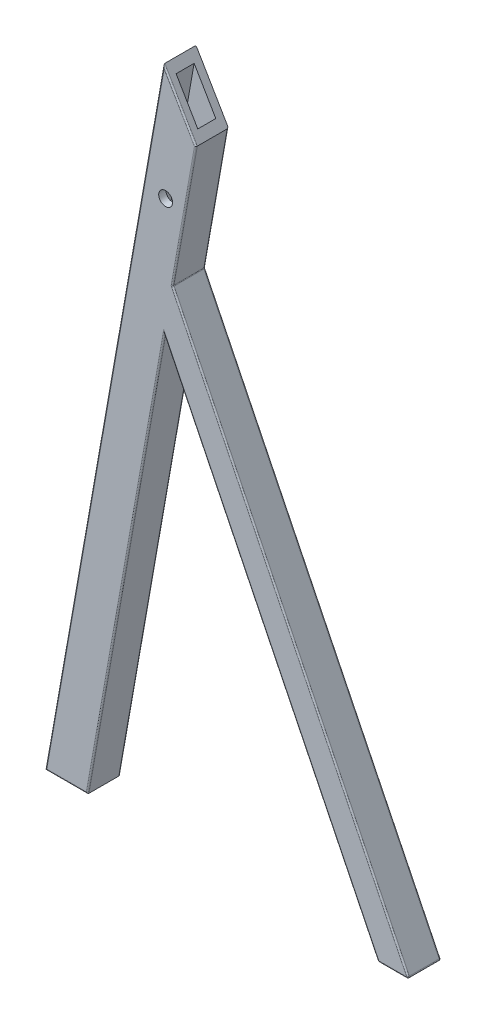
ISO-10303-21;
HEADER;
FILE_DESCRIPTION(('STEP AP214'),'2;1');
FILE_NAME('part.step','',(''),(''),'','','');
FILE_SCHEMA(('AUTOMOTIVE_DESIGN { 1 0 10303 214 1 1 1 1 }'));
ENDSEC;
DATA;
#1=APPLICATION_CONTEXT('core data for automotive mechanical design processes');
#2=APPLICATION_PROTOCOL_DEFINITION('international standard','automotive_design',2000,#1);
#3=PRODUCT_CONTEXT('',#1,'mechanical');
#4=PRODUCT('Part','Part','',(#3));
#5=PRODUCT_RELATED_PRODUCT_CATEGORY('part','',(#4));
#6=PRODUCT_DEFINITION_FORMATION('','',#4);
#7=PRODUCT_DEFINITION_CONTEXT('part definition',#1,'design');
#8=PRODUCT_DEFINITION('design','',#6,#7);
#9=PRODUCT_DEFINITION_SHAPE('','',#8);
#10=(LENGTH_UNIT() NAMED_UNIT(*) SI_UNIT(.MILLI.,.METRE.));
#11=(NAMED_UNIT(*) PLANE_ANGLE_UNIT() SI_UNIT($,.RADIAN.));
#12=(NAMED_UNIT(*) SI_UNIT($,.STERADIAN.) SOLID_ANGLE_UNIT());
#13=UNCERTAINTY_MEASURE_WITH_UNIT(LENGTH_MEASURE(1.E-05),#10,'distance_accuracy_value','');
#14=(GEOMETRIC_REPRESENTATION_CONTEXT(3) GLOBAL_UNCERTAINTY_ASSIGNED_CONTEXT((#13)) GLOBAL_UNIT_ASSIGNED_CONTEXT((#10,
#11,#12)) REPRESENTATION_CONTEXT('',''));
#15=CARTESIAN_POINT('',(0.,0.,0.));
#16=DIRECTION('',(0.,0.,1.));
#17=DIRECTION('',(1.,0.,0.));
#18=AXIS2_PLACEMENT_3D('',#15,#16,#17);
#19=CARTESIAN_POINT('',(-131.308416878332,443.163488855493,11.75));
#20=DIRECTION('',(-0.86306070064201,-0.505100214816152,0.));
#21=DIRECTION('',(0.505100214816152,-0.86306070064201,0.));
#22=AXIS2_PLACEMENT_3D('',#19,#20,#21);
#23=PLANE('',#22);
#24=DIRECTION('',(0.,0.,-1.));
#25=VECTOR('',#24,1.);
#26=CARTESIAN_POINT('',(-154.718136006566,483.163488855493,11.75));
#27=LINE('',#26,#25);
#28=CARTESIAN_POINT('',(-154.718136006566,483.163488855493,10.75));
#29=VERTEX_POINT('',#28);
#30=CARTESIAN_POINT('',(-154.718136006566,483.163488855493,-10.75));
#31=VERTEX_POINT('',#30);
#32=EDGE_CURVE('E268',#29,#31,#27,.T.);
#33=ORIENTED_EDGE('',*,*,#32,.F.);
#34=DIRECTION('',(-0.505100214816152,0.86306070064201,0.));
#35=VECTOR('',#34,1.);
#36=CARTESIAN_POINT('',(-131.308416878332,443.163488855493,10.75));
#37=LINE('',#36,#35);
#38=CARTESIAN_POINT('',(-131.308416878332,443.163488855493,10.75));
#39=VERTEX_POINT('',#38);
#40=EDGE_CURVE('E376',#29,#39,#37,.F.);
#41=ORIENTED_EDGE('',*,*,#40,.T.);
#42=DIRECTION('',(0.,0.,-1.));
#43=VECTOR('',#42,1.);
#44=CARTESIAN_POINT('',(-131.308416878332,443.163488855493,11.75));
#45=LINE('',#44,#43);
#46=CARTESIAN_POINT('',(-131.308416878332,443.163488855493,-10.75));
#47=VERTEX_POINT('',#46);
#48=EDGE_CURVE('E274',#39,#47,#45,.T.);
#49=ORIENTED_EDGE('',*,*,#48,.T.);
#50=CARTESIAN_POINT('',(-132.088740849273,444.496822188827,-10.75));
#51=DIRECTION('',(-0.86306070064201,-0.505100214816152,0.));
#52=DIRECTION('',(-0.505100214816152,0.86306070064201,0.));
#53=AXIS2_PLACEMENT_3D('',#50,#51,#52);
#54=ELLIPSE('',#53,1.54488940620456,1.);
#55=CARTESIAN_POINT('',(-132.088740849273,444.496822188827,-11.75));
#56=VERTEX_POINT('',#55);
#57=EDGE_CURVE('E372',#47,#56,#54,.F.);
#58=ORIENTED_EDGE('',*,*,#57,.T.);
#59=DIRECTION('',(-0.505100214816151,0.86306070064201,0.));
#60=VECTOR('',#59,1.);
#61=CARTESIAN_POINT('',(-131.308416878332,443.163488855493,-11.75));
#62=LINE('',#61,#60);
#63=CARTESIAN_POINT('',(-153.937812035625,481.83015552216,-11.75));
#64=VERTEX_POINT('',#63);
#65=EDGE_CURVE('E262',#56,#64,#62,.T.);
#66=ORIENTED_EDGE('',*,*,#65,.T.);
#67=CARTESIAN_POINT('',(-153.937812035625,481.83015552216,-10.75));
#68=DIRECTION('',(-0.86306070064201,-0.505100214816152,0.));
#69=DIRECTION('',(0.505100214816152,-0.86306070064201,0.));
#70=AXIS2_PLACEMENT_3D('',#67,#68,#69);
#71=ELLIPSE('',#70,1.54488940620456,1.);
#72=EDGE_CURVE('E374',#64,#31,#71,.F.);
#73=ORIENTED_EDGE('',*,*,#72,.T.);
#74=EDGE_LOOP('',(#33,#41,#49,#58,#66,#73));
#75=FACE_BOUND('',#74,.T.);
#76=DIRECTION('',(-0.505100214816152,0.86306070064201,0.));
#77=VECTOR('',#76,1.);
#78=CARTESIAN_POINT('',(-131.308416878332,443.163488855493,-6.5));
#79=LINE('',#78,#77);
#80=CARTESIAN_POINT('',(-135.210036733033,449.830155522152,-6.5));
#81=VERTEX_POINT('',#80);
#82=CARTESIAN_POINT('',(-150.816516151855,476.496822188818,-6.5));
#83=VERTEX_POINT('',#82);
#84=EDGE_CURVE('E234',#81,#83,#79,.T.);
#85=ORIENTED_EDGE('',*,*,#84,.F.);
#86=DIRECTION('',(0.,0.,1.));
#87=VECTOR('',#86,1.);
#88=CARTESIAN_POINT('',(-135.210036733033,449.830155522152,11.75));
#89=LINE('',#88,#87);
#90=CARTESIAN_POINT('',(-135.210036733033,449.830155522152,6.5));
#91=VERTEX_POINT('',#90);
#92=EDGE_CURVE('E287',#81,#91,#89,.T.);
#93=ORIENTED_EDGE('',*,*,#92,.T.);
#94=DIRECTION('',(-0.505100214816152,0.86306070064201,0.));
#95=VECTOR('',#94,1.);
#96=CARTESIAN_POINT('',(-131.308416878332,443.163488855493,6.5));
#97=LINE('',#96,#95);
#98=CARTESIAN_POINT('',(-150.816516151855,476.496822188818,6.5));
#99=VERTEX_POINT('',#98);
#100=EDGE_CURVE('E267',#91,#99,#97,.T.);
#101=ORIENTED_EDGE('',*,*,#100,.T.);
#102=DIRECTION('',(0.,0.,-1.));
#103=VECTOR('',#102,1.);
#104=CARTESIAN_POINT('',(-150.816516151855,476.496822188818,11.75));
#105=LINE('',#104,#103);
#106=EDGE_CURVE('E290',#99,#83,#105,.T.);
#107=ORIENTED_EDGE('',*,*,#106,.T.);
#108=EDGE_LOOP('',(#85,#93,#101,#107));
#109=FACE_BOUND('',#108,.T.);
#110=ADVANCED_FACE('F67',(#75,#109),#23,.F.);
#111=CARTESIAN_POINT('',(0.,0.,11.75));
#112=DIRECTION('',(-0.89795077821304,-0.440095898534168,0.));
#113=DIRECTION('',(0.440095898534168,-0.89795077821304,0.));
#114=AXIS2_PLACEMENT_3D('',#111,#112,#113);
#115=PLANE('',#114);
#116=DIRECTION('',(0.,0.,-1.));
#117=VECTOR('',#116,1.);
#118=CARTESIAN_POINT('',(-0.274415373989586,0.559904101465832,11.75));
#119=LINE('',#118,#117);
#120=CARTESIAN_POINT('',(-0.274415373989586,0.559904101465832,-10.75));
#121=VERTEX_POINT('',#120);
#122=CARTESIAN_POINT('',(-0.274415373989586,0.559904101465832,10.75));
#123=VERTEX_POINT('',#122);
#124=EDGE_CURVE('E351',#121,#123,#119,.F.);
#125=ORIENTED_EDGE('',*,*,#124,.T.);
#126=DIRECTION('',(-0.440095898534168,0.89795077821304,0.));
#127=VECTOR('',#126,1.);
#128=CARTESIAN_POINT('',(0.,0.,10.75));
#129=LINE('',#128,#127);
#130=CARTESIAN_POINT('',(-154.033564486959,314.282772374564,10.75));
#131=VERTEX_POINT('',#130);
#132=EDGE_CURVE('E355',#123,#131,#129,.T.);
#133=ORIENTED_EDGE('',*,*,#132,.T.);
#134=DIRECTION('',(0.,0.,-1.));
#135=VECTOR('',#134,1.);
#136=CARTESIAN_POINT('',(-154.033564486959,314.282772374564,11.75));
#137=LINE('',#136,#135);
#138=CARTESIAN_POINT('',(-154.033564486959,314.282772374564,-10.75));
#139=VERTEX_POINT('',#138);
#140=EDGE_CURVE('E264',#131,#139,#137,.T.);
#141=ORIENTED_EDGE('',*,*,#140,.T.);
#142=DIRECTION('',(-0.440095898534168,0.89795077821304,0.));
#143=VECTOR('',#142,1.);
#144=CARTESIAN_POINT('',(0.,0.,-10.75));
#145=LINE('',#144,#143);
#146=EDGE_CURVE('E353',#139,#121,#145,.F.);
#147=ORIENTED_EDGE('',*,*,#146,.T.);
#148=EDGE_LOOP('',(#125,#133,#141,#147));
#149=FACE_BOUND('',#148,.T.);
#150=ADVANCED_FACE('F481',(#149),#115,.T.);
#151=CARTESIAN_POINT('',(0.,0.,11.75));
#152=DIRECTION('',(0.,1.,0.));
#153=DIRECTION('',(0.,0.,1.));
#154=AXIS2_PLACEMENT_3D('',#151,#152,#153);
#155=PLANE('',#154);
#156=DIRECTION('',(1.,0.,0.));
#157=VECTOR('',#156,1.);
#158=CARTESIAN_POINT('',(0.,0.,10.75));
#159=LINE('',#158,#157);
#160=CARTESIAN_POINT('',(20.6691775894452,0.,10.75));
#161=VERTEX_POINT('',#160);
#162=CARTESIAN_POINT('',(0.623535404223453,0.,10.75));
#163=VERTEX_POINT('',#162);
#164=EDGE_CURVE('E346',#161,#163,#159,.F.);
#165=ORIENTED_EDGE('',*,*,#164,.T.);
#166=DIRECTION('',(0.,0.,-1.));
#167=VECTOR('',#166,1.);
#168=CARTESIAN_POINT('',(0.623535404223453,0.,-11.75));
#169=LINE('',#168,#167);
#170=CARTESIAN_POINT('',(0.623535404223453,0.,-10.75));
#171=VERTEX_POINT('',#170);
#172=EDGE_CURVE('E349',#163,#171,#169,.T.);
#173=ORIENTED_EDGE('',*,*,#172,.T.);
#174=DIRECTION('',(1.,0.,0.));
#175=VECTOR('',#174,1.);
#176=CARTESIAN_POINT('',(0.,0.,-10.75));
#177=LINE('',#176,#175);
#178=CARTESIAN_POINT('',(20.6691775894452,0.,-10.75));
#179=VERTEX_POINT('',#178);
#180=EDGE_CURVE('E344',#171,#179,#177,.T.);
#181=ORIENTED_EDGE('',*,*,#180,.T.);
#182=DIRECTION('',(0.,0.,-1.));
#183=VECTOR('',#182,1.);
#184=CARTESIAN_POINT('',(20.6691775894452,0.,11.75));
#185=LINE('',#184,#183);
#186=EDGE_CURVE('E342',#179,#161,#185,.F.);
#187=ORIENTED_EDGE('',*,*,#186,.T.);
#188=EDGE_LOOP('',(#165,#173,#181,#187));
#189=FACE_BOUND('',#188,.T.);
#190=ADVANCED_FACE('F487',(#189),#155,.F.);
#191=CARTESIAN_POINT('',(17.9590155642608,8.80191797068336,11.75));
#192=DIRECTION('',(0.89795077821304,0.440095898534168,0.));
#193=DIRECTION('',(-0.440095898534168,0.89795077821304,0.));
#194=AXIS2_PLACEMENT_3D('',#191,#192,#193);
#195=PLANE('',#194);
#196=DIRECTION('',(0.440095898534168,-0.89795077821304,0.));
#197=VECTOR('',#196,1.);
#198=CARTESIAN_POINT('',(17.9590155642608,8.80191797068336,10.75));
#199=LINE('',#198,#197);
#200=CARTESIAN_POINT('',(-147.997104106124,347.410905928949,10.75));
#201=VERTEX_POINT('',#200);
#202=CARTESIAN_POINT('',(21.5671283676583,1.44009589853417,10.75));
#203=VERTEX_POINT('',#202);
#204=EDGE_CURVE('E315',#201,#203,#199,.T.);
#205=ORIENTED_EDGE('',*,*,#204,.T.);
#206=DIRECTION('',(0.,0.,-1.));
#207=VECTOR('',#206,1.);
#208=CARTESIAN_POINT('',(21.5671283676583,1.44009589853417,-11.75));
#209=LINE('',#208,#207);
#210=CARTESIAN_POINT('',(21.5671283676583,1.44009589853417,-10.75));
#211=VERTEX_POINT('',#210);
#212=EDGE_CURVE('E320',#203,#211,#209,.T.);
#213=ORIENTED_EDGE('',*,*,#212,.T.);
#214=DIRECTION('',(0.440095898534168,-0.89795077821304,0.));
#215=VECTOR('',#214,1.);
#216=CARTESIAN_POINT('',(-148.140567139862,347.70362109221,-10.75));
#217=LINE('',#216,#215);
#218=CARTESIAN_POINT('',(-147.997104106124,347.410905928949,-10.75));
#219=VERTEX_POINT('',#218);
#220=EDGE_CURVE('E317',#211,#219,#217,.F.);
#221=ORIENTED_EDGE('',*,*,#220,.T.);
#222=DIRECTION('',(0.,0.,-1.));
#223=VECTOR('',#222,1.);
#224=CARTESIAN_POINT('',(-147.997104106124,347.410905928949,11.75));
#225=LINE('',#224,#223);
#226=EDGE_CURVE('E313',#219,#201,#225,.F.);
#227=ORIENTED_EDGE('',*,*,#226,.T.);
#228=EDGE_LOOP('',(#205,#213,#221,#227));
#229=FACE_BOUND('',#228,.T.);
#230=ADVANCED_FACE('F632',(#229),#195,.T.);
#231=CARTESIAN_POINT('',(0.,0.,-11.75));
#232=DIRECTION('',(0.,0.,1.));
#233=DIRECTION('',(1.,0.,0.));
#234=AXIS2_PLACEMENT_3D('',#231,#232,#233);
#235=PLANE('',#234);
#236=CARTESIAN_POINT('',(-153.135277111465,400.,-11.75));
#237=DIRECTION('',(0.,0.,1.));
#238=DIRECTION('',(1.,0.,0.));
#239=AXIS2_PLACEMENT_3D('',#236,#237,#238);
#240=CIRCLE('',#239,5.00000000000002);
#241=CARTESIAN_POINT('',(-148.135277111465,400.,-11.75));
#242=VERTEX_POINT('',#241);
#243=EDGE_CURVE('E297',#242,#242,#240,.T.);
#244=ORIENTED_EDGE('',*,*,#243,.T.);
#245=EDGE_LOOP('',(#244));
#246=FACE_BOUND('',#245,.T.);
#247=DIRECTION('',(1.,0.,0.));
#248=VECTOR('',#247,1.);
#249=CARTESIAN_POINT('',(-239.912895185025,0.,-11.75));
#250=LINE('',#249,#248);
#251=CARTESIAN_POINT('',(-238.897468573139,0.,-11.75));
#252=VERTEX_POINT('',#251);
#253=CARTESIAN_POINT('',(-210.465523440338,0.,-11.75));
#254=VERTEX_POINT('',#253);
#255=EDGE_CURVE('E271',#252,#254,#250,.T.);
#256=ORIENTED_EDGE('',*,*,#255,.F.);
#257=DIRECTION('',(-0.173648177666934,-0.984807753012207,0.));
#258=VECTOR('',#257,1.);
#259=CARTESIAN_POINT('',(-231.693828457875,40.8538732207631,-11.75));
#260=LINE('',#259,#258);
#261=EDGE_CURVE('E311',#252,#64,#260,.F.);
#262=ORIENTED_EDGE('',*,*,#261,.T.);
#263=ORIENTED_EDGE('',*,*,#65,.F.);
#264=DIRECTION('',(0.173648177666934,0.984807753012207,0.));
#265=VECTOR('',#264,1.);
#266=CARTESIAN_POINT('',(-204.119211373534,35.9917242460889,-11.75));
#267=LINE('',#266,#265);
#268=CARTESIAN_POINT('',(-149.068768833935,348.198298182817,-11.75));
#269=VERTEX_POINT('',#268);
#270=EDGE_CURVE('E300',#56,#269,#267,.F.);
#271=ORIENTED_EDGE('',*,*,#270,.T.);
#272=CARTESIAN_POINT('',(-147.099153327911,347.851001827483,-11.75));
#273=DIRECTION('',(0.,0.,1.));
#274=DIRECTION('',(1.,0.,0.));
#275=AXIS2_PLACEMENT_3D('',#272,#273,#274);
#276=CIRCLE('',#275,2.);
#277=CARTESIAN_POINT('',(-148.895054884337,346.970810030415,-11.75));
#278=VERTEX_POINT('',#277);
#279=EDGE_CURVE('E293',#278,#269,#276,.F.);
#280=ORIENTED_EDGE('',*,*,#279,.F.);
#281=DIRECTION('',(0.440095898534168,-0.89795077821304,0.));
#282=VECTOR('',#281,1.);
#283=CARTESIAN_POINT('',(21.3749849831445,-0.44009589853417,-11.75));
#284=LINE('',#283,#282);
#285=CARTESIAN_POINT('',(20.6691775894452,1.,-11.75));
#286=VERTEX_POINT('',#285);
#287=EDGE_CURVE('E302',#278,#286,#284,.T.);
#288=ORIENTED_EDGE('',*,*,#287,.T.);
#289=DIRECTION('',(1.,0.,0.));
#290=VECTOR('',#289,1.);
#291=CARTESIAN_POINT('',(0.,1.,-11.75));
#292=LINE('',#291,#290);
#293=CARTESIAN_POINT('',(0.623535404223453,1.,-11.75));
#294=VERTEX_POINT('',#293);
#295=EDGE_CURVE('E305',#286,#294,#292,.F.);
#296=ORIENTED_EDGE('',*,*,#295,.T.);
#297=DIRECTION('',(-0.440095898534168,0.89795077821304,0.));
#298=VECTOR('',#297,1.);
#299=CARTESIAN_POINT('',(-153.135613708746,314.722868273098,-11.75));
#300=LINE('',#299,#298);
#301=CARTESIAN_POINT('',(-154.4856785642,317.477476511055,-11.75));
#302=VERTEX_POINT('',#301);
#303=EDGE_CURVE('E307',#294,#302,#300,.T.);
#304=ORIENTED_EDGE('',*,*,#303,.T.);
#305=DIRECTION('',(0.173648177666934,0.984807753012207,0.));
#306=VECTOR('',#305,1.);
#307=CARTESIAN_POINT('',(-204.119211373534,35.9917242460889,-11.75));
#308=LINE('',#307,#306);
#309=EDGE_CURVE('E309',#302,#254,#308,.F.);
#310=ORIENTED_EDGE('',*,*,#309,.T.);
#311=EDGE_LOOP('',(#256,#262,#263,#271,#280,#288,#296,#304,#310));
#312=FACE_BOUND('',#311,.T.);
#313=ADVANCED_FACE('F653',(#246,#312),#235,.F.);
#314=CARTESIAN_POINT('',(0.,0.,11.75));
#315=DIRECTION('',(0.,0.,1.));
#316=DIRECTION('',(1.,0.,0.));
#317=AXIS2_PLACEMENT_3D('',#314,#315,#316);
#318=PLANE('',#317);
#319=DIRECTION('',(-0.440095898534168,0.89795077821304,0.));
#320=VECTOR('',#319,1.);
#321=CARTESIAN_POINT('',(0.89795077821304,0.440095898534168,11.75));
#322=LINE('',#321,#320);
#323=CARTESIAN_POINT('',(-154.4856785642,317.477476511055,11.75));
#324=VERTEX_POINT('',#323);
#325=CARTESIAN_POINT('',(0.623535404223453,1.,11.75));
#326=VERTEX_POINT('',#325);
#327=EDGE_CURVE('E337',#324,#326,#322,.F.);
#328=ORIENTED_EDGE('',*,*,#327,.T.);
#329=DIRECTION('',(1.,0.,0.));
#330=VECTOR('',#329,1.);
#331=CARTESIAN_POINT('',(22.2729357613575,1.,11.75));
#332=LINE('',#331,#330);
#333=CARTESIAN_POINT('',(20.6691775894452,1.,11.75));
#334=VERTEX_POINT('',#333);
#335=EDGE_CURVE('E339',#326,#334,#332,.T.);
#336=ORIENTED_EDGE('',*,*,#335,.T.);
#337=DIRECTION('',(0.440095898534168,-0.89795077821304,0.));
#338=VECTOR('',#337,1.);
#339=CARTESIAN_POINT('',(17.0610647860478,8.36182207214919,11.75));
#340=LINE('',#339,#338);
#341=CARTESIAN_POINT('',(-148.895054884337,346.970810030415,11.75));
#342=VERTEX_POINT('',#341);
#343=EDGE_CURVE('E325',#334,#342,#340,.F.);
#344=ORIENTED_EDGE('',*,*,#343,.T.);
#345=CARTESIAN_POINT('',(-147.099153327911,347.851001827483,11.75));
#346=DIRECTION('',(0.,0.,1.));
#347=DIRECTION('',(1.,0.,0.));
#348=AXIS2_PLACEMENT_3D('',#345,#346,#347);
#349=CIRCLE('',#348,2.);
#350=CARTESIAN_POINT('',(-149.068768833935,348.198298182817,11.75));
#351=VERTEX_POINT('',#350);
#352=EDGE_CURVE('E322',#351,#342,#349,.T.);
#353=ORIENTED_EDGE('',*,*,#352,.F.);
#354=DIRECTION('',(0.173648177666934,0.984807753012207,0.));
#355=VECTOR('',#354,1.);
#356=CARTESIAN_POINT('',(-132.293224631344,443.33713703316,11.75));
#357=LINE('',#356,#355);
#358=CARTESIAN_POINT('',(-132.357008079358,442.97540312405,11.75));
#359=VERTEX_POINT('',#358);
#360=EDGE_CURVE('E327',#351,#359,#357,.T.);
#361=ORIENTED_EDGE('',*,*,#360,.T.);
#362=DIRECTION('',(-0.505100214816152,0.86306070064201,0.));
#363=VECTOR('',#362,1.);
#364=CARTESIAN_POINT('',(-155.581196707208,482.658388640677,11.75));
#365=LINE('',#364,#363);
#366=CARTESIAN_POINT('',(-154.206079265709,480.308736457383,11.75));
#367=VERTEX_POINT('',#366);
#368=EDGE_CURVE('E329',#359,#367,#365,.T.);
#369=ORIENTED_EDGE('',*,*,#368,.T.);
#370=DIRECTION('',(-0.173648177666934,-0.984807753012207,0.));
#371=VECTOR('',#370,1.);
#372=CARTESIAN_POINT('',(-238.928087432013,-0.173648177666977,11.75));
#373=LINE('',#372,#371);
#374=CARTESIAN_POINT('',(-238.721141592431,0.999999999999964,11.75));
#375=VERTEX_POINT('',#374);
#376=EDGE_CURVE('E331',#367,#375,#373,.T.);
#377=ORIENTED_EDGE('',*,*,#376,.T.);
#378=DIRECTION('',(1.,0.,0.));
#379=VECTOR('',#378,1.);
#380=CARTESIAN_POINT('',(-209.450096828452,0.999999999999965,11.75));
#381=LINE('',#380,#379);
#382=CARTESIAN_POINT('',(-210.28919645963,0.999999999999965,11.75));
#383=VERTEX_POINT('',#382);
#384=EDGE_CURVE('E333',#375,#383,#381,.T.);
#385=ORIENTED_EDGE('',*,*,#384,.T.);
#386=DIRECTION('',(0.173648177666934,0.984807753012207,0.));
#387=VECTOR('',#386,1.);
#388=CARTESIAN_POINT('',(-155.018372239971,314.456420552231,11.75));
#389=LINE('',#388,#387);
#390=EDGE_CURVE('E335',#383,#324,#389,.T.);
#391=ORIENTED_EDGE('',*,*,#390,.T.);
#392=EDGE_LOOP('',(#328,#336,#344,#353,#361,#369,#377,#385,#391));
#393=FACE_BOUND('',#392,.T.);
#394=CARTESIAN_POINT('',(-153.135277111465,400.,11.75));
#395=DIRECTION('',(0.,0.,1.));
#396=DIRECTION('',(1.,0.,0.));
#397=AXIS2_PLACEMENT_3D('',#394,#395,#396);
#398=CIRCLE('',#397,5.00000000000002);
#399=CARTESIAN_POINT('',(-148.135277111465,400.,11.75));
#400=VERTEX_POINT('',#399);
#401=EDGE_CURVE('E450',#400,#400,#398,.T.);
#402=ORIENTED_EDGE('',*,*,#401,.F.);
#403=EDGE_LOOP('',(#402));
#404=FACE_BOUND('',#403,.T.);
#405=ADVANCED_FACE('F639',(#393,#404),#318,.T.);
#406=CARTESIAN_POINT('',(-154.718136006566,483.163488855493,11.75));
#407=DIRECTION('',(0.984807753012207,-0.173648177666934,0.));
#408=DIRECTION('',(0.173648177666934,0.984807753012207,0.));
#409=AXIS2_PLACEMENT_3D('',#406,#407,#408);
#410=PLANE('',#409);
#411=DIRECTION('',(0.,0.,-1.));
#412=VECTOR('',#411,1.);
#413=CARTESIAN_POINT('',(-239.912895185025,0.,11.75));
#414=LINE('',#413,#412);
#415=CARTESIAN_POINT('',(-239.912895185025,0.,10.75));
#416=VERTEX_POINT('',#415);
#417=CARTESIAN_POINT('',(-239.912895185025,0.,-10.75));
#418=VERTEX_POINT('',#417);
#419=EDGE_CURVE('E280',#416,#418,#414,.T.);
#420=ORIENTED_EDGE('',*,*,#419,.F.);
#421=DIRECTION('',(-0.173648177666934,-0.984807753012207,0.));
#422=VECTOR('',#421,1.);
#423=CARTESIAN_POINT('',(-154.718136006566,483.163488855493,10.75));
#424=LINE('',#423,#422);
#425=EDGE_CURVE('E370',#416,#29,#424,.F.);
#426=ORIENTED_EDGE('',*,*,#425,.T.);
#427=ORIENTED_EDGE('',*,*,#32,.T.);
#428=DIRECTION('',(-0.173648177666934,-0.984807753012207,0.));
#429=VECTOR('',#428,1.);
#430=CARTESIAN_POINT('',(-154.718136006566,483.163488855493,-10.75));
#431=LINE('',#430,#429);
#432=EDGE_CURVE('E367',#31,#418,#431,.T.);
#433=ORIENTED_EDGE('',*,*,#432,.T.);
#434=EDGE_LOOP('',(#420,#426,#427,#433));
#435=FACE_BOUND('',#434,.T.);
#436=ADVANCED_FACE('F494',(#435),#410,.F.);
#437=CARTESIAN_POINT('',(-239.912895185025,0.,11.75));
#438=DIRECTION('',(0.,1.,0.));
#439=DIRECTION('',(0.,0.,1.));
#440=AXIS2_PLACEMENT_3D('',#437,#438,#439);
#441=PLANE('',#440);
#442=DIRECTION('',(0.,0.,-1.));
#443=VECTOR('',#442,1.);
#444=CARTESIAN_POINT('',(-209.450096828452,0.,11.75));
#445=LINE('',#444,#443);
#446=CARTESIAN_POINT('',(-209.450096828452,0.,10.75));
#447=VERTEX_POINT('',#446);
#448=CARTESIAN_POINT('',(-209.450096828452,0.,-10.75));
#449=VERTEX_POINT('',#448);
#450=EDGE_CURVE('E277',#447,#449,#445,.T.);
#451=ORIENTED_EDGE('',*,*,#450,.F.);
#452=DIRECTION('',(1.,0.,0.));
#453=VECTOR('',#452,1.);
#454=CARTESIAN_POINT('',(-239.912895185025,0.,10.75));
#455=LINE('',#454,#453);
#456=EDGE_CURVE('E365',#447,#416,#455,.F.);
#457=ORIENTED_EDGE('',*,*,#456,.T.);
#458=ORIENTED_EDGE('',*,*,#419,.T.);
#459=CARTESIAN_POINT('',(-238.897468573139,0.,-10.75));
#460=DIRECTION('',(0.,1.,0.));
#461=DIRECTION('',(-1.,0.,0.));
#462=AXIS2_PLACEMENT_3D('',#459,#460,#461);
#463=ELLIPSE('',#462,1.01542661188575,1.);
#464=EDGE_CURVE('E361',#418,#252,#463,.F.);
#465=ORIENTED_EDGE('',*,*,#464,.T.);
#466=ORIENTED_EDGE('',*,*,#255,.T.);
#467=CARTESIAN_POINT('',(-210.465523440338,0.,-10.75));
#468=DIRECTION('',(0.,1.,0.));
#469=DIRECTION('',(1.,0.,0.));
#470=AXIS2_PLACEMENT_3D('',#467,#468,#469);
#471=ELLIPSE('',#470,1.01542661188575,1.);
#472=EDGE_CURVE('E363',#254,#449,#471,.F.);
#473=ORIENTED_EDGE('',*,*,#472,.T.);
#474=EDGE_LOOP('',(#451,#457,#458,#465,#466,#473));
#475=FACE_BOUND('',#474,.T.);
#476=ADVANCED_FACE('F597',(#475),#441,.F.);
#477=CARTESIAN_POINT('',(-209.450096828452,0.,11.75));
#478=DIRECTION('',(-0.984807753012207,0.173648177666934,0.));
#479=DIRECTION('',(-0.173648177666934,-0.984807753012207,0.));
#480=AXIS2_PLACEMENT_3D('',#477,#478,#479);
#481=PLANE('',#480);
#482=ORIENTED_EDGE('',*,*,#140,.F.);
#483=DIRECTION('',(0.173648177666934,0.984807753012207,0.));
#484=VECTOR('',#483,1.);
#485=CARTESIAN_POINT('',(-209.450096828452,0.,10.75));
#486=LINE('',#485,#484);
#487=EDGE_CURVE('E359',#131,#447,#486,.F.);
#488=ORIENTED_EDGE('',*,*,#487,.T.);
#489=ORIENTED_EDGE('',*,*,#450,.T.);
#490=DIRECTION('',(0.173648177666934,0.984807753012207,0.));
#491=VECTOR('',#490,1.);
#492=CARTESIAN_POINT('',(-209.450096828452,0.,-10.75));
#493=LINE('',#492,#491);
#494=EDGE_CURVE('E357',#449,#139,#493,.T.);
#495=ORIENTED_EDGE('',*,*,#494,.T.);
#496=EDGE_LOOP('',(#482,#488,#489,#495));
#497=FACE_BOUND('',#496,.T.);
#498=ADVANCED_FACE('F603',(#497),#481,.F.);
#499=ORIENTED_EDGE('',*,*,#48,.F.);
#500=DIRECTION('',(0.173648177666934,0.984807753012207,0.));
#501=VECTOR('',#500,1.);
#502=CARTESIAN_POINT('',(-148.140567139862,347.70362109221,10.75));
#503=LINE('',#502,#501);
#504=CARTESIAN_POINT('',(-148.083961080923,348.02465000515,10.75));
#505=VERTEX_POINT('',#504);
#506=EDGE_CURVE('E12',#39,#505,#503,.F.);
#507=ORIENTED_EDGE('',*,*,#506,.T.);
#508=DIRECTION('',(0.,0.,-1.));
#509=VECTOR('',#508,1.);
#510=CARTESIAN_POINT('',(-148.083961080923,348.02465000515,11.75));
#511=LINE('',#510,#509);
#512=CARTESIAN_POINT('',(-148.083961080923,348.02465000515,-10.75));
#513=VERTEX_POINT('',#512);
#514=EDGE_CURVE('E76',#505,#513,#511,.T.);
#515=ORIENTED_EDGE('',*,*,#514,.T.);
#516=DIRECTION('',(0.173648177666934,0.984807753012207,0.));
#517=VECTOR('',#516,1.);
#518=CARTESIAN_POINT('',(-209.450096828452,0.,-10.75));
#519=LINE('',#518,#517);
#520=EDGE_CURVE('E378',#513,#47,#519,.T.);
#521=ORIENTED_EDGE('',*,*,#520,.T.);
#522=EDGE_LOOP('',(#499,#507,#515,#521));
#523=FACE_BOUND('',#522,.T.);
#524=ADVANCED_FACE('F651',(#523),#481,.F.);
#525=CARTESIAN_POINT('',(-139.266538581599,542.,-6.5));
#526=DIRECTION('',(-0.984807753012205,0.173648177666947,0.));
#527=DIRECTION('',(-0.173648177666947,-0.984807753012205,0.));
#528=AXIS2_PLACEMENT_3D('',#525,#526,#527);
#529=PLANE('',#528);
#530=DIRECTION('',(-0.173648177666947,-0.984807753012205,0.));
#531=VECTOR('',#530,1.);
#532=CARTESIAN_POINT('',(-139.266538581599,542.,6.5));
#533=LINE('',#532,#531);
#534=CARTESIAN_POINT('',(-234.483108164179,2.,6.5));
#535=VERTEX_POINT('',#534);
#536=EDGE_CURVE('E243',#99,#535,#533,.T.);
#537=ORIENTED_EDGE('',*,*,#536,.T.);
#538=DIRECTION('',(0.,0.,1.));
#539=VECTOR('',#538,1.);
#540=CARTESIAN_POINT('',(-234.483108164179,2.,-6.5));
#541=LINE('',#540,#539);
#542=CARTESIAN_POINT('',(-234.483108164179,2.,-6.5));
#543=VERTEX_POINT('',#542);
#544=EDGE_CURVE('E241',#543,#535,#541,.T.);
#545=ORIENTED_EDGE('',*,*,#544,.F.);
#546=DIRECTION('',(-0.173648177666947,-0.984807753012205,0.));
#547=VECTOR('',#546,1.);
#548=CARTESIAN_POINT('',(-139.266538581599,542.,-6.5));
#549=LINE('',#548,#547);
#550=EDGE_CURVE('E227',#83,#543,#549,.T.);
#551=ORIENTED_EDGE('',*,*,#550,.F.);
#552=ORIENTED_EDGE('',*,*,#106,.F.);
#553=EDGE_LOOP('',(#537,#545,#551,#552));
#554=FACE_BOUND('',#553,.T.);
#555=ADVANCED_FACE('F242',(#554),#529,.F.);
#556=CARTESIAN_POINT('',(-214.174575926464,2.,-6.5));
#557=DIRECTION('',(0.984807753012205,-0.173648177666947,0.));
#558=DIRECTION('',(0.173648177666947,0.984807753012205,0.));
#559=AXIS2_PLACEMENT_3D('',#556,#557,#558);
#560=PLANE('',#559);
#561=DIRECTION('',(0.173648177666947,0.984807753012205,0.));
#562=VECTOR('',#561,1.);
#563=CARTESIAN_POINT('',(-214.174575926464,2.,-6.5));
#564=LINE('',#563,#562);
#565=CARTESIAN_POINT('',(-214.174575926464,2.,-6.5));
#566=VERTEX_POINT('',#565);
#567=EDGE_CURVE('E248',#566,#81,#564,.T.);
#568=ORIENTED_EDGE('',*,*,#567,.F.);
#569=DIRECTION('',(0.,0.,1.));
#570=VECTOR('',#569,1.);
#571=CARTESIAN_POINT('',(-214.174575926464,2.,-6.5));
#572=LINE('',#571,#570);
#573=CARTESIAN_POINT('',(-214.174575926464,2.,6.5));
#574=VERTEX_POINT('',#573);
#575=EDGE_CURVE('E247',#566,#574,#572,.T.);
#576=ORIENTED_EDGE('',*,*,#575,.T.);
#577=DIRECTION('',(0.173648177666947,0.984807753012205,0.));
#578=VECTOR('',#577,1.);
#579=CARTESIAN_POINT('',(-214.174575926464,2.,6.5));
#580=LINE('',#579,#578);
#581=EDGE_CURVE('E238',#574,#91,#580,.T.);
#582=ORIENTED_EDGE('',*,*,#581,.T.);
#583=ORIENTED_EDGE('',*,*,#92,.F.);
#584=EDGE_LOOP('',(#568,#576,#582,#583));
#585=FACE_BOUND('',#584,.T.);
#586=ADVANCED_FACE('F469',(#585),#560,.F.);
#587=CARTESIAN_POINT('',(0.,0.,-6.5));
#588=DIRECTION('',(0.,0.,1.));
#589=DIRECTION('',(1.,0.,0.));
#590=AXIS2_PLACEMENT_3D('',#587,#588,#589);
#591=PLANE('',#590);
#592=CARTESIAN_POINT('',(-153.135277111465,400.,-6.5));
#593=DIRECTION('',(0.,0.,1.));
#594=DIRECTION('',(1.,0.,0.));
#595=AXIS2_PLACEMENT_3D('',#592,#593,#594);
#596=CIRCLE('',#595,5.00000000000002);
#597=CARTESIAN_POINT('',(-148.135277111465,400.,-6.5));
#598=VERTEX_POINT('',#597);
#599=EDGE_CURVE('E258',#598,#598,#596,.T.);
#600=ORIENTED_EDGE('',*,*,#599,.F.);
#601=EDGE_LOOP('',(#600));
#602=FACE_BOUND('',#601,.T.);
#603=ORIENTED_EDGE('',*,*,#84,.T.);
#604=ORIENTED_EDGE('',*,*,#550,.T.);
#605=DIRECTION('',(1.,0.,0.));
#606=VECTOR('',#605,1.);
#607=CARTESIAN_POINT('',(-234.483108164179,2.,-6.5));
#608=LINE('',#607,#606);
#609=EDGE_CURVE('E232',#543,#566,#608,.T.);
#610=ORIENTED_EDGE('',*,*,#609,.T.);
#611=ORIENTED_EDGE('',*,*,#567,.T.);
#612=EDGE_LOOP('',(#603,#604,#610,#611));
#613=FACE_BOUND('',#612,.T.);
#614=ADVANCED_FACE('F229',(#602,#613),#591,.T.);
#615=CARTESIAN_POINT('',(0.,0.,6.5));
#616=DIRECTION('',(0.,0.,1.));
#617=DIRECTION('',(1.,0.,0.));
#618=AXIS2_PLACEMENT_3D('',#615,#616,#617);
#619=PLANE('',#618);
#620=CARTESIAN_POINT('',(-153.135277111465,400.,6.5));
#621=DIRECTION('',(0.,0.,1.));
#622=DIRECTION('',(1.,0.,0.));
#623=AXIS2_PLACEMENT_3D('',#620,#621,#622);
#624=CIRCLE('',#623,5.00000000000002);
#625=CARTESIAN_POINT('',(-148.135277111465,400.,6.5));
#626=VERTEX_POINT('',#625);
#627=EDGE_CURVE('E294',#626,#626,#624,.T.);
#628=ORIENTED_EDGE('',*,*,#627,.T.);
#629=EDGE_LOOP('',(#628));
#630=FACE_BOUND('',#629,.T.);
#631=ORIENTED_EDGE('',*,*,#581,.F.);
#632=DIRECTION('',(1.,0.,0.));
#633=VECTOR('',#632,1.);
#634=CARTESIAN_POINT('',(-234.483108164179,2.,6.5));
#635=LINE('',#634,#633);
#636=EDGE_CURVE('E257',#535,#574,#635,.T.);
#637=ORIENTED_EDGE('',*,*,#636,.F.);
#638=ORIENTED_EDGE('',*,*,#536,.F.);
#639=ORIENTED_EDGE('',*,*,#100,.F.);
#640=EDGE_LOOP('',(#631,#637,#638,#639));
#641=FACE_BOUND('',#640,.T.);
#642=ADVANCED_FACE('F468',(#630,#641),#619,.F.);
#643=CARTESIAN_POINT('',(-234.483108164179,2.,-6.5));
#644=DIRECTION('',(0.,-1.,0.));
#645=DIRECTION('',(0.,0.,-1.));
#646=AXIS2_PLACEMENT_3D('',#643,#644,#645);
#647=PLANE('',#646);
#648=ORIENTED_EDGE('',*,*,#636,.T.);
#649=ORIENTED_EDGE('',*,*,#575,.F.);
#650=ORIENTED_EDGE('',*,*,#609,.F.);
#651=ORIENTED_EDGE('',*,*,#544,.T.);
#652=EDGE_LOOP('',(#648,#649,#650,#651));
#653=FACE_BOUND('',#652,.T.);
#654=ADVANCED_FACE('F250',(#653),#647,.F.);
#655=CARTESIAN_POINT('',(-153.135277111465,400.,-11.75));
#656=DIRECTION('',(0.,0.,1.));
#657=DIRECTION('',(1.,0.,0.));
#658=AXIS2_PLACEMENT_3D('',#655,#656,#657);
#659=CYLINDRICAL_SURFACE('',#658,5.00000000000002);
#660=ORIENTED_EDGE('',*,*,#401,.T.);
#661=EDGE_LOOP('',(#660));
#662=FACE_BOUND('',#661,.T.);
#663=ORIENTED_EDGE('',*,*,#627,.F.);
#664=EDGE_LOOP('',(#663));
#665=FACE_BOUND('',#664,.T.);
#666=ADVANCED_FACE('F583',(#662,#665),#659,.F.);
#667=ORIENTED_EDGE('',*,*,#599,.T.);
#668=EDGE_LOOP('',(#667));
#669=FACE_BOUND('',#668,.T.);
#670=ORIENTED_EDGE('',*,*,#243,.F.);
#671=EDGE_LOOP('',(#670));
#672=FACE_BOUND('',#671,.T.);
#673=ADVANCED_FACE('F464',(#669,#672),#659,.F.);
#674=CARTESIAN_POINT('',(0.,0.999999999999965,10.75));
#675=DIRECTION('',(-1.,0.,0.));
#676=DIRECTION('',(0.,0.,1.));
#677=AXIS2_PLACEMENT_3D('',#674,#675,#676);
#678=CYLINDRICAL_SURFACE('',#677,1.);
#679=CARTESIAN_POINT('',(-238.721141592431,0.999999999999966,10.75));
#680=DIRECTION('',(-0.642787609686538,0.766044443118979,0.));
#681=DIRECTION('',(0.766044443118979,0.642787609686538,0.));
#682=AXIS2_PLACEMENT_3D('',#679,#680,#681);
#683=ELLIPSE('',#682,1.55572382686042,1.);
#684=EDGE_CURVE('E443',#416,#375,#683,.T.);
#685=ORIENTED_EDGE('',*,*,#684,.F.);
#686=ORIENTED_EDGE('',*,*,#456,.F.);
#687=CARTESIAN_POINT('',(-210.28919645963,0.999999999999966,10.75));
#688=DIRECTION('',(-0.766044443118979,-0.642787609686538,0.));
#689=DIRECTION('',(-0.642787609686538,0.766044443118979,0.));
#690=AXIS2_PLACEMENT_3D('',#687,#688,#689);
#691=ELLIPSE('',#690,1.30540728933228,1.);
#692=EDGE_CURVE('E71',#383,#447,#691,.F.);
#693=ORIENTED_EDGE('',*,*,#692,.F.);
#694=ORIENTED_EDGE('',*,*,#384,.F.);
#695=EDGE_LOOP('',(#685,#686,#693,#694));
#696=FACE_BOUND('',#695,.T.);
#697=ADVANCED_FACE('F577',(#696),#678,.T.);
#698=CARTESIAN_POINT('',(-204.119211373534,35.9917242460889,10.75));
#699=DIRECTION('',(-0.173648177666934,-0.984807753012207,0.));
#700=DIRECTION('',(0.984807753012207,-0.173648177666934,0.));
#701=AXIS2_PLACEMENT_3D('',#698,#699,#700);
#702=CYLINDRICAL_SURFACE('',#701,1.);
#703=ORIENTED_EDGE('',*,*,#692,.T.);
#704=ORIENTED_EDGE('',*,*,#487,.F.);
#705=CARTESIAN_POINT('',(-154.4856785642,317.477476511055,10.75));
#706=DIRECTION('',(-0.990134015925798,-0.140123625797549,0.));
#707=DIRECTION('',(-0.140123625797549,0.990134015925798,0.));
#708=AXIS2_PLACEMENT_3D('',#705,#706,#707);
#709=ELLIPSE('',#708,3.22653710013607,1.);
#710=EDGE_CURVE('E441',#324,#131,#709,.F.);
#711=ORIENTED_EDGE('',*,*,#710,.F.);
#712=ORIENTED_EDGE('',*,*,#390,.F.);
#713=EDGE_LOOP('',(#703,#704,#711,#712));
#714=FACE_BOUND('',#713,.T.);
#715=ADVANCED_FACE('F575',(#714),#702,.T.);
#716=CARTESIAN_POINT('',(-231.693828457875,40.8538732207631,10.75));
#717=DIRECTION('',(0.173648177666934,0.984807753012207,0.));
#718=DIRECTION('',(-0.984807753012207,0.173648177666934,0.));
#719=AXIS2_PLACEMENT_3D('',#716,#717,#718);
#720=CYLINDRICAL_SURFACE('',#719,1.);
#721=ORIENTED_EDGE('',*,*,#684,.T.);
#722=ORIENTED_EDGE('',*,*,#376,.F.);
#723=CARTESIAN_POINT('',(-154.206079265709,480.308736457383,10.75));
#724=DIRECTION('',(0.984291268160599,0.176552256917887,0.));
#725=DIRECTION('',(0.176552256917887,-0.984291268160599,0.));
#726=AXIS2_PLACEMENT_3D('',#723,#724,#725);
#727=ELLIPSE('',#726,2.90031263148849,1.);
#728=EDGE_CURVE('E438',#29,#367,#727,.T.);
#729=ORIENTED_EDGE('',*,*,#728,.F.);
#730=ORIENTED_EDGE('',*,*,#425,.F.);
#731=EDGE_LOOP('',(#721,#722,#729,#730));
#732=FACE_BOUND('',#731,.T.);
#733=ADVANCED_FACE('F571',(#732),#720,.T.);
#734=CARTESIAN_POINT('',(0.89795077821304,0.440095898534168,10.75));
#735=DIRECTION('',(-0.440095898534168,0.89795077821304,0.));
#736=DIRECTION('',(-0.89795077821304,-0.440095898534168,0.));
#737=AXIS2_PLACEMENT_3D('',#734,#735,#736);
#738=CYLINDRICAL_SURFACE('',#737,1.);
#739=ORIENTED_EDGE('',*,*,#710,.T.);
#740=ORIENTED_EDGE('',*,*,#132,.F.);
#741=CARTESIAN_POINT('',(0.623535404223453,1.,10.75));
#742=DIRECTION('',(0.440095898534168,-0.89795077821304,0.));
#743=DIRECTION('',(0.89795077821304,0.440095898534168,0.));
#744=AXIS2_PLACEMENT_3D('',#741,#742,#743);
#745=CIRCLE('',#744,1.);
#746=EDGE_CURVE('E435',#326,#123,#745,.T.);
#747=ORIENTED_EDGE('',*,*,#746,.F.);
#748=ORIENTED_EDGE('',*,*,#327,.F.);
#749=EDGE_LOOP('',(#739,#740,#747,#748));
#750=FACE_BOUND('',#749,.T.);
#751=ADVANCED_FACE('F567',(#750),#738,.T.);
#752=CARTESIAN_POINT('',(94.5179538060965,55.3159687794022,10.75));
#753=DIRECTION('',(0.505100214816152,-0.86306070064201,0.));
#754=DIRECTION('',(0.86306070064201,0.505100214816152,0.));
#755=AXIS2_PLACEMENT_3D('',#752,#753,#754);
#756=CYLINDRICAL_SURFACE('',#755,1.);
#757=ORIENTED_EDGE('',*,*,#728,.T.);
#758=ORIENTED_EDGE('',*,*,#368,.F.);
#759=CARTESIAN_POINT('',(-132.357008079358,442.97540312405,10.75));
#760=DIRECTION('',(0.176552256917887,-0.984291268160599,0.));
#761=DIRECTION('',(-0.984291268160599,-0.176552256917887,0.));
#762=AXIS2_PLACEMENT_3D('',#759,#760,#761);
#763=ELLIPSE('',#762,1.06532612341981,1.);
#764=EDGE_CURVE('E432',#39,#359,#763,.T.);
#765=ORIENTED_EDGE('',*,*,#764,.F.);
#766=ORIENTED_EDGE('',*,*,#40,.F.);
#767=EDGE_LOOP('',(#757,#758,#765,#766));
#768=FACE_BOUND('',#767,.T.);
#769=ADVANCED_FACE('F563',(#768),#756,.T.);
#770=CARTESIAN_POINT('',(-210.434904581465,0.173648177666899,-10.75));
#771=DIRECTION('',(0.173648177666934,0.984807753012207,0.));
#772=DIRECTION('',(-0.984807753012207,0.173648177666934,0.));
#773=AXIS2_PLACEMENT_3D('',#770,#771,#772);
#774=CYLINDRICAL_SURFACE('',#773,1.);
#775=ORIENTED_EDGE('',*,*,#472,.F.);
#776=ORIENTED_EDGE('',*,*,#309,.F.);
#777=CARTESIAN_POINT('',(-154.4856785642,317.477476511055,-10.75));
#778=DIRECTION('',(0.990134015925798,0.140123625797549,0.));
#779=DIRECTION('',(0.140123625797549,-0.990134015925798,0.));
#780=AXIS2_PLACEMENT_3D('',#777,#778,#779);
#781=ELLIPSE('',#780,3.22653710013607,1.);
#782=EDGE_CURVE('E429',#139,#302,#781,.T.);
#783=ORIENTED_EDGE('',*,*,#782,.F.);
#784=ORIENTED_EDGE('',*,*,#494,.F.);
#785=EDGE_LOOP('',(#775,#776,#783,#784));
#786=FACE_BOUND('',#785,.T.);
#787=ADVANCED_FACE('F559',(#786),#774,.T.);
#788=CARTESIAN_POINT('',(0.623535404223453,1.,10.75));
#789=DIRECTION('',(0.,0.,1.));
#790=DIRECTION('',(1.,0.,0.));
#791=AXIS2_PLACEMENT_3D('',#788,#789,#790);
#792=SPHERICAL_SURFACE('',#791,1.);
#793=CARTESIAN_POINT('',(0.623535404223453,1.,10.75));
#794=DIRECTION('',(-1.,0.,0.));
#795=DIRECTION('',(0.,0.,1.));
#796=AXIS2_PLACEMENT_3D('',#793,#794,#795);
#797=CIRCLE('',#796,1.);
#798=EDGE_CURVE('E423',#326,#163,#797,.F.);
#799=ORIENTED_EDGE('',*,*,#798,.F.);
#800=ORIENTED_EDGE('',*,*,#746,.T.);
#801=CARTESIAN_POINT('',(0.623535404223453,1.,10.75));
#802=DIRECTION('',(0.,0.,1.));
#803=DIRECTION('',(1.,0.,0.));
#804=AXIS2_PLACEMENT_3D('',#801,#802,#803);
#805=CIRCLE('',#804,1.);
#806=EDGE_CURVE('E426',#163,#123,#805,.F.);
#807=ORIENTED_EDGE('',*,*,#806,.F.);
#808=EDGE_LOOP('',(#799,#800,#807));
#809=FACE_BOUND('',#808,.T.);
#810=ADVANCED_FACE('F555',(#809),#792,.T.);
#811=CARTESIAN_POINT('',(-204.119211373534,35.9917242460889,10.75));
#812=DIRECTION('',(-0.173648177666934,-0.984807753012207,0.));
#813=DIRECTION('',(0.984807753012207,-0.173648177666934,0.));
#814=AXIS2_PLACEMENT_3D('',#811,#812,#813);
#815=CYLINDRICAL_SURFACE('',#814,1.);
#816=ORIENTED_EDGE('',*,*,#764,.T.);
#817=ORIENTED_EDGE('',*,*,#360,.F.);
#818=CARTESIAN_POINT('',(-149.068768833935,348.198298182817,10.75));
#819=DIRECTION('',(-0.173648177666907,-0.984807753012212,0.));
#820=DIRECTION('',(0.984807753012212,-0.173648177666907,0.));
#821=AXIS2_PLACEMENT_3D('',#818,#819,#820);
#822=CIRCLE('',#821,1.);
#823=EDGE_CURVE('E417',#505,#351,#822,.T.);
#824=ORIENTED_EDGE('',*,*,#823,.F.);
#825=ORIENTED_EDGE('',*,*,#506,.F.);
#826=EDGE_LOOP('',(#816,#817,#824,#825));
#827=FACE_BOUND('',#826,.T.);
#828=ADVANCED_FACE('F551',(#827),#815,.T.);
#829=CARTESIAN_POINT('',(0.89795077821304,0.440095898534168,-10.75));
#830=DIRECTION('',(0.440095898534168,-0.89795077821304,0.));
#831=DIRECTION('',(0.89795077821304,0.440095898534168,0.));
#832=AXIS2_PLACEMENT_3D('',#829,#830,#831);
#833=CYLINDRICAL_SURFACE('',#832,1.);
#834=ORIENTED_EDGE('',*,*,#782,.T.);
#835=ORIENTED_EDGE('',*,*,#303,.F.);
#836=CARTESIAN_POINT('',(0.623535404223453,1.,-10.75));
#837=DIRECTION('',(0.440095898534168,-0.89795077821304,0.));
#838=DIRECTION('',(0.89795077821304,0.440095898534168,0.));
#839=AXIS2_PLACEMENT_3D('',#836,#837,#838);
#840=CIRCLE('',#839,1.);
#841=EDGE_CURVE('E414',#121,#294,#840,.T.);
#842=ORIENTED_EDGE('',*,*,#841,.F.);
#843=ORIENTED_EDGE('',*,*,#146,.F.);
#844=EDGE_LOOP('',(#834,#835,#842,#843));
#845=FACE_BOUND('',#844,.T.);
#846=ADVANCED_FACE('F547',(#845),#833,.T.);
#847=CARTESIAN_POINT('',(0.623535404223453,1.,11.75));
#848=DIRECTION('',(0.,0.,1.));
#849=DIRECTION('',(1.,0.,0.));
#850=AXIS2_PLACEMENT_3D('',#847,#848,#849);
#851=CYLINDRICAL_SURFACE('',#850,1.);
#852=ORIENTED_EDGE('',*,*,#806,.T.);
#853=ORIENTED_EDGE('',*,*,#124,.F.);
#854=CARTESIAN_POINT('',(0.623535404223453,1.,-10.75));
#855=DIRECTION('',(0.,0.,-1.));
#856=DIRECTION('',(-1.,0.,0.));
#857=AXIS2_PLACEMENT_3D('',#854,#855,#856);
#858=CIRCLE('',#857,1.);
#859=EDGE_CURVE('E411',#171,#121,#858,.T.);
#860=ORIENTED_EDGE('',*,*,#859,.F.);
#861=ORIENTED_EDGE('',*,*,#172,.F.);
#862=EDGE_LOOP('',(#852,#853,#860,#861));
#863=FACE_BOUND('',#862,.T.);
#864=ADVANCED_FACE('F543',(#863),#851,.T.);
#865=CARTESIAN_POINT('',(0.,1.,10.75));
#866=DIRECTION('',(-1.,0.,0.));
#867=DIRECTION('',(0.,0.,1.));
#868=AXIS2_PLACEMENT_3D('',#865,#866,#867);
#869=CYLINDRICAL_SURFACE('',#868,1.);
#870=ORIENTED_EDGE('',*,*,#798,.T.);
#871=ORIENTED_EDGE('',*,*,#164,.F.);
#872=CARTESIAN_POINT('',(20.6691775894452,1.,10.75));
#873=DIRECTION('',(1.,0.,0.));
#874=DIRECTION('',(0.,1.,0.));
#875=AXIS2_PLACEMENT_3D('',#872,#873,#874);
#876=CIRCLE('',#875,1.);
#877=EDGE_CURVE('E408',#334,#161,#876,.T.);
#878=ORIENTED_EDGE('',*,*,#877,.F.);
#879=ORIENTED_EDGE('',*,*,#335,.F.);
#880=EDGE_LOOP('',(#870,#871,#878,#879));
#881=FACE_BOUND('',#880,.T.);
#882=ADVANCED_FACE('F539',(#881),#869,.T.);
#883=CARTESIAN_POINT('',(17.0610647860478,8.36182207214919,10.75));
#884=DIRECTION('',(0.440095898534168,-0.89795077821304,0.));
#885=DIRECTION('',(0.89795077821304,0.440095898534168,0.));
#886=AXIS2_PLACEMENT_3D('',#883,#884,#885);
#887=CYLINDRICAL_SURFACE('',#886,1.);
#888=CARTESIAN_POINT('',(-148.895054884337,346.970810030415,10.75));
#889=DIRECTION('',(-0.440095898534169,0.897950778213039,0.));
#890=DIRECTION('',(-0.897950778213039,-0.440095898534169,0.));
#891=AXIS2_PLACEMENT_3D('',#888,#889,#890);
#892=CIRCLE('',#891,1.);
#893=EDGE_CURVE('E420',#342,#201,#892,.T.);
#894=ORIENTED_EDGE('',*,*,#893,.F.);
#895=ORIENTED_EDGE('',*,*,#343,.F.);
#896=CARTESIAN_POINT('',(20.6691775894452,1.,10.75));
#897=DIRECTION('',(0.440095898534167,-0.89795077821304,0.));
#898=DIRECTION('',(0.89795077821304,0.440095898534167,0.));
#899=AXIS2_PLACEMENT_3D('',#896,#897,#898);
#900=CIRCLE('',#899,1.);
#901=EDGE_CURVE('E406',#203,#334,#900,.T.);
#902=ORIENTED_EDGE('',*,*,#901,.F.);
#903=ORIENTED_EDGE('',*,*,#204,.F.);
#904=EDGE_LOOP('',(#894,#895,#902,#903));
#905=FACE_BOUND('',#904,.T.);
#906=ADVANCED_FACE('F535',(#905),#887,.T.);
#907=CARTESIAN_POINT('',(-147.099153327911,347.851001827483,10.75));
#908=DIRECTION('',(0.,0.,1.));
#909=DIRECTION('',(1.,0.,0.));
#910=AXIS2_PLACEMENT_3D('',#907,#908,#909);
#911=TOROIDAL_SURFACE('',#910,2.,1.);
#912=ORIENTED_EDGE('',*,*,#352,.T.);
#913=ORIENTED_EDGE('',*,*,#893,.T.);
#914=CARTESIAN_POINT('',(-147.099153327911,347.851001827483,10.75));
#915=DIRECTION('',(0.,0.,1.));
#916=DIRECTION('',(1.,0.,0.));
#917=AXIS2_PLACEMENT_3D('',#914,#915,#916);
#918=CIRCLE('',#917,1.);
#919=EDGE_CURVE('E403',#505,#201,#918,.T.);
#920=ORIENTED_EDGE('',*,*,#919,.F.);
#921=ORIENTED_EDGE('',*,*,#823,.T.);
#922=EDGE_LOOP('',(#912,#913,#920,#921));
#923=FACE_BOUND('',#922,.T.);
#924=ADVANCED_FACE('F531',(#923),#911,.T.);
#925=CARTESIAN_POINT('',(0.623535404223453,1.,-10.75));
#926=DIRECTION('',(0.,0.,-1.));
#927=DIRECTION('',(-1.,0.,0.));
#928=AXIS2_PLACEMENT_3D('',#925,#926,#927);
#929=SPHERICAL_SURFACE('',#928,1.);
#930=ORIENTED_EDGE('',*,*,#859,.T.);
#931=ORIENTED_EDGE('',*,*,#841,.T.);
#932=CARTESIAN_POINT('',(0.623535404223453,1.,-10.75));
#933=DIRECTION('',(-1.,0.,0.));
#934=DIRECTION('',(0.,-1.,0.));
#935=AXIS2_PLACEMENT_3D('',#932,#933,#934);
#936=CIRCLE('',#935,1.);
#937=EDGE_CURVE('E400',#171,#294,#936,.F.);
#938=ORIENTED_EDGE('',*,*,#937,.F.);
#939=EDGE_LOOP('',(#930,#931,#938));
#940=FACE_BOUND('',#939,.T.);
#941=ADVANCED_FACE('F527',(#940),#929,.T.);
#942=CARTESIAN_POINT('',(20.6691775894452,1.,10.75));
#943=DIRECTION('',(0.,0.,1.));
#944=DIRECTION('',(1.,0.,0.));
#945=AXIS2_PLACEMENT_3D('',#942,#943,#944);
#946=SPHERICAL_SURFACE('',#945,1.);
#947=ORIENTED_EDGE('',*,*,#901,.T.);
#948=ORIENTED_EDGE('',*,*,#877,.T.);
#949=CARTESIAN_POINT('',(20.6691775894452,1.,10.75));
#950=DIRECTION('',(0.,0.,1.));
#951=DIRECTION('',(1.,0.,0.));
#952=AXIS2_PLACEMENT_3D('',#949,#950,#951);
#953=CIRCLE('',#952,1.);
#954=EDGE_CURVE('E397',#203,#161,#953,.F.);
#955=ORIENTED_EDGE('',*,*,#954,.F.);
#956=EDGE_LOOP('',(#947,#948,#955));
#957=FACE_BOUND('',#956,.T.);
#958=ADVANCED_FACE('F523',(#957),#946,.T.);
#959=CARTESIAN_POINT('',(-147.099153327911,347.851001827483,11.75));
#960=DIRECTION('',(0.,0.,-1.));
#961=DIRECTION('',(-1.,0.,0.));
#962=AXIS2_PLACEMENT_3D('',#959,#960,#961);
#963=CYLINDRICAL_SURFACE('',#962,1.);
#964=ORIENTED_EDGE('',*,*,#919,.T.);
#965=ORIENTED_EDGE('',*,*,#226,.F.);
#966=CARTESIAN_POINT('',(-147.099153327911,347.851001827483,-10.75));
#967=DIRECTION('',(0.,0.,1.));
#968=DIRECTION('',(1.,0.,0.));
#969=AXIS2_PLACEMENT_3D('',#966,#967,#968);
#970=CIRCLE('',#969,1.);
#971=EDGE_CURVE('E394',#513,#219,#970,.T.);
#972=ORIENTED_EDGE('',*,*,#971,.F.);
#973=ORIENTED_EDGE('',*,*,#514,.F.);
#974=EDGE_LOOP('',(#964,#965,#972,#973));
#975=FACE_BOUND('',#974,.T.);
#976=ADVANCED_FACE('F519',(#975),#963,.F.);
#977=CARTESIAN_POINT('',(-210.434904581465,0.173648177666899,-10.75));
#978=DIRECTION('',(0.173648177666934,0.984807753012207,0.));
#979=DIRECTION('',(-0.984807753012207,0.173648177666934,0.));
#980=AXIS2_PLACEMENT_3D('',#977,#978,#979);
#981=CYLINDRICAL_SURFACE('',#980,1.);
#982=ORIENTED_EDGE('',*,*,#57,.F.);
#983=ORIENTED_EDGE('',*,*,#520,.F.);
#984=CARTESIAN_POINT('',(-149.068768833935,348.198298182817,-10.75));
#985=DIRECTION('',(-0.173648177666903,-0.984807753012213,0.));
#986=DIRECTION('',(0.984807753012213,-0.173648177666903,0.));
#987=AXIS2_PLACEMENT_3D('',#984,#985,#986);
#988=CIRCLE('',#987,1.);
#989=EDGE_CURVE('E391',#269,#513,#988,.T.);
#990=ORIENTED_EDGE('',*,*,#989,.F.);
#991=ORIENTED_EDGE('',*,*,#270,.F.);
#992=EDGE_LOOP('',(#982,#983,#990,#991));
#993=FACE_BOUND('',#992,.T.);
#994=ADVANCED_FACE('F515',(#993),#981,.T.);
#995=CARTESIAN_POINT('',(0.,1.,-10.75));
#996=DIRECTION('',(1.,0.,0.));
#997=DIRECTION('',(0.,0.,-1.));
#998=AXIS2_PLACEMENT_3D('',#995,#996,#997);
#999=CYLINDRICAL_SURFACE('',#998,1.);
#1000=ORIENTED_EDGE('',*,*,#937,.T.);
#1001=ORIENTED_EDGE('',*,*,#295,.F.);
#1002=CARTESIAN_POINT('',(20.6691775894452,1.,-10.75));
#1003=DIRECTION('',(1.,0.,0.));
#1004=DIRECTION('',(0.,0.,-1.));
#1005=AXIS2_PLACEMENT_3D('',#1002,#1003,#1004);
#1006=CIRCLE('',#1005,1.);
#1007=EDGE_CURVE('E388',#179,#286,#1006,.T.);
#1008=ORIENTED_EDGE('',*,*,#1007,.F.);
#1009=ORIENTED_EDGE('',*,*,#180,.F.);
#1010=EDGE_LOOP('',(#1000,#1001,#1008,#1009));
#1011=FACE_BOUND('',#1010,.T.);
#1012=ADVANCED_FACE('F511',(#1011),#999,.T.);
#1013=CARTESIAN_POINT('',(20.6691775894452,1.,11.75));
#1014=DIRECTION('',(0.,0.,1.));
#1015=DIRECTION('',(1.,0.,0.));
#1016=AXIS2_PLACEMENT_3D('',#1013,#1014,#1015);
#1017=CYLINDRICAL_SURFACE('',#1016,1.);
#1018=ORIENTED_EDGE('',*,*,#954,.T.);
#1019=ORIENTED_EDGE('',*,*,#186,.F.);
#1020=CARTESIAN_POINT('',(20.6691775894452,1.,-10.75));
#1021=DIRECTION('',(0.,0.,-1.));
#1022=DIRECTION('',(-1.,0.,0.));
#1023=AXIS2_PLACEMENT_3D('',#1020,#1021,#1022);
#1024=CIRCLE('',#1023,1.);
#1025=EDGE_CURVE('E385',#211,#179,#1024,.T.);
#1026=ORIENTED_EDGE('',*,*,#1025,.F.);
#1027=ORIENTED_EDGE('',*,*,#212,.F.);
#1028=EDGE_LOOP('',(#1018,#1019,#1026,#1027));
#1029=FACE_BOUND('',#1028,.T.);
#1030=ADVANCED_FACE('F507',(#1029),#1017,.T.);
#1031=CARTESIAN_POINT('',(-147.099153327911,347.851001827483,-10.75));
#1032=DIRECTION('',(0.,0.,1.));
#1033=DIRECTION('',(1.,0.,0.));
#1034=AXIS2_PLACEMENT_3D('',#1031,#1032,#1033);
#1035=TOROIDAL_SURFACE('',#1034,2.,1.);
#1036=ORIENTED_EDGE('',*,*,#989,.T.);
#1037=ORIENTED_EDGE('',*,*,#971,.T.);
#1038=CARTESIAN_POINT('',(-148.895054884337,346.970810030415,-10.75));
#1039=DIRECTION('',(-0.440095898534169,0.897950778213039,0.));
#1040=DIRECTION('',(-0.897950778213039,-0.440095898534169,0.));
#1041=AXIS2_PLACEMENT_3D('',#1038,#1039,#1040);
#1042=CIRCLE('',#1041,1.);
#1043=EDGE_CURVE('E383',#278,#219,#1042,.F.);
#1044=ORIENTED_EDGE('',*,*,#1043,.F.);
#1045=ORIENTED_EDGE('',*,*,#279,.T.);
#1046=EDGE_LOOP('',(#1036,#1037,#1044,#1045));
#1047=FACE_BOUND('',#1046,.T.);
#1048=ADVANCED_FACE('F503',(#1047),#1035,.T.);
#1049=CARTESIAN_POINT('',(20.6691775894452,1.,-10.75));
#1050=DIRECTION('',(0.,0.,-1.));
#1051=DIRECTION('',(-1.,0.,0.));
#1052=AXIS2_PLACEMENT_3D('',#1049,#1050,#1051);
#1053=SPHERICAL_SURFACE('',#1052,1.);
#1054=ORIENTED_EDGE('',*,*,#1025,.T.);
#1055=ORIENTED_EDGE('',*,*,#1007,.T.);
#1056=CARTESIAN_POINT('',(20.6691775894452,1.,-10.75));
#1057=DIRECTION('',(0.440095898534168,-0.89795077821304,0.));
#1058=DIRECTION('',(0.89795077821304,0.440095898534168,0.));
#1059=AXIS2_PLACEMENT_3D('',#1056,#1057,#1058);
#1060=CIRCLE('',#1059,1.);
#1061=EDGE_CURVE('E381',#211,#286,#1060,.F.);
#1062=ORIENTED_EDGE('',*,*,#1061,.F.);
#1063=EDGE_LOOP('',(#1054,#1055,#1062));
#1064=FACE_BOUND('',#1063,.T.);
#1065=ADVANCED_FACE('F499',(#1064),#1053,.T.);
#1066=CARTESIAN_POINT('',(17.0610647860478,8.36182207214919,-10.75));
#1067=DIRECTION('',(-0.440095898534168,0.89795077821304,0.));
#1068=DIRECTION('',(-0.89795077821304,-0.440095898534168,0.));
#1069=AXIS2_PLACEMENT_3D('',#1066,#1067,#1068);
#1070=CYLINDRICAL_SURFACE('',#1069,1.);
#1071=ORIENTED_EDGE('',*,*,#1043,.T.);
#1072=ORIENTED_EDGE('',*,*,#220,.F.);
#1073=ORIENTED_EDGE('',*,*,#1061,.T.);
#1074=ORIENTED_EDGE('',*,*,#287,.F.);
#1075=EDGE_LOOP('',(#1071,#1072,#1073,#1074));
#1076=FACE_BOUND('',#1075,.T.);
#1077=ADVANCED_FACE('F496',(#1076),#1070,.T.);
#1078=CARTESIAN_POINT('',(-153.733328253554,482.989840677826,-10.75));
#1079=DIRECTION('',(-0.173648177666934,-0.984807753012207,0.));
#1080=DIRECTION('',(0.984807753012207,-0.173648177666934,0.));
#1081=AXIS2_PLACEMENT_3D('',#1078,#1079,#1080);
#1082=CYLINDRICAL_SURFACE('',#1081,1.);
#1083=ORIENTED_EDGE('',*,*,#72,.F.);
#1084=ORIENTED_EDGE('',*,*,#261,.F.);
#1085=ORIENTED_EDGE('',*,*,#464,.F.);
#1086=ORIENTED_EDGE('',*,*,#432,.F.);
#1087=EDGE_LOOP('',(#1083,#1084,#1085,#1086));
#1088=FACE_BOUND('',#1087,.T.);
#1089=ADVANCED_FACE('F69',(#1088),#1082,.T.);
#1090=CLOSED_SHELL('',(#110,#150,#190,#230,#313,#405,#436,#476,#498,#524,#555,#586,#614,#642,
#654,#666,#673,#697,#715,#733,#751,#769,#787,#810,#828,#846,#864,#882,#906,#924,#941,#958,#976,
#994,#1012,#1030,#1048,#1065,#1077,#1089));
#1091=MANIFOLD_SOLID_BREP('B2',#1090);
#1092=ADVANCED_BREP_SHAPE_REPRESENTATION('',(#18,#1091),#14);
#1093=SHAPE_DEFINITION_REPRESENTATION(#9,#1092);
ENDSEC;
END-ISO-10303-21;
